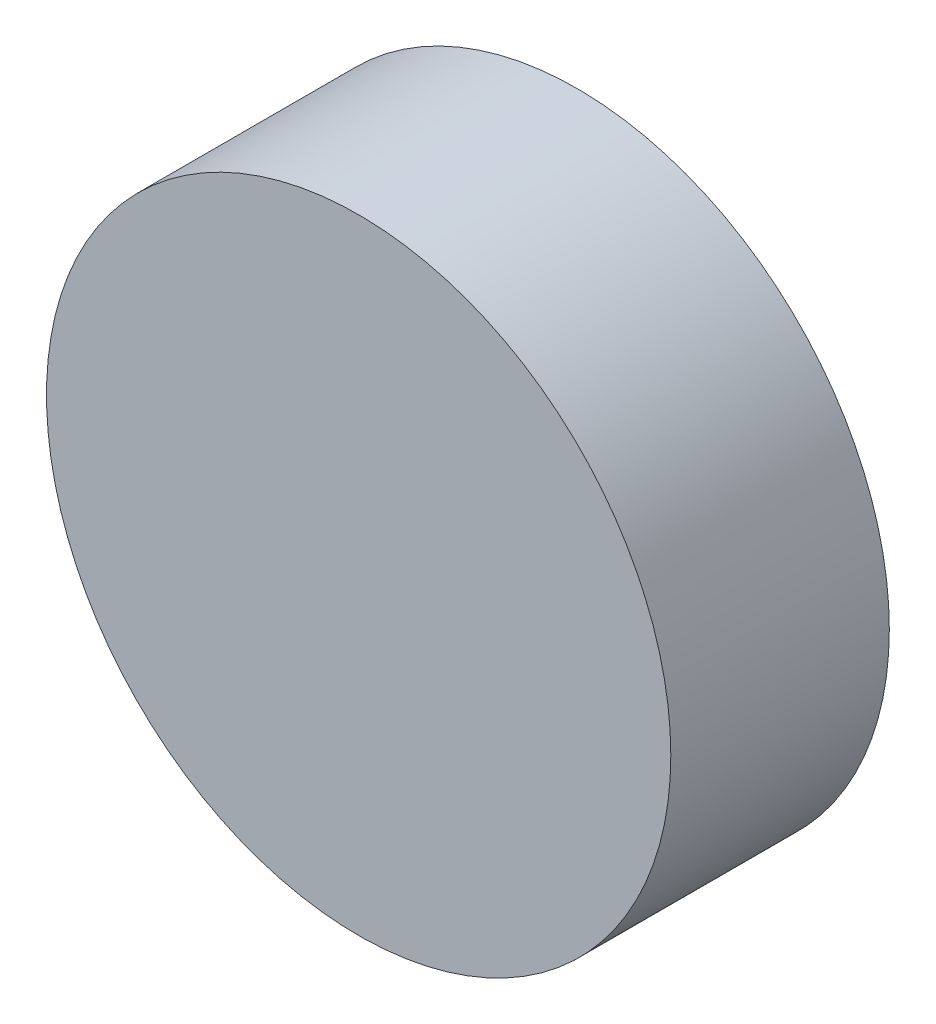
ISO-10303-21;
HEADER;
FILE_DESCRIPTION(('STEP AP214'),'2;1');
FILE_NAME('part.step','',(''),(''),'','','');
FILE_SCHEMA(('AUTOMOTIVE_DESIGN { 1 0 10303 214 1 1 1 1 }'));
ENDSEC;
DATA;
#1=APPLICATION_CONTEXT('core data for automotive mechanical design processes');
#2=APPLICATION_PROTOCOL_DEFINITION('international standard','automotive_design',2000,#1);
#3=PRODUCT_CONTEXT('',#1,'mechanical');
#4=PRODUCT('Part','Part','',(#3));
#5=PRODUCT_RELATED_PRODUCT_CATEGORY('part','',(#4));
#6=PRODUCT_DEFINITION_FORMATION('','',#4);
#7=PRODUCT_DEFINITION_CONTEXT('part definition',#1,'design');
#8=PRODUCT_DEFINITION('design','',#6,#7);
#9=PRODUCT_DEFINITION_SHAPE('','',#8);
#10=(LENGTH_UNIT() NAMED_UNIT(*) SI_UNIT(.MILLI.,.METRE.));
#11=(NAMED_UNIT(*) PLANE_ANGLE_UNIT() SI_UNIT($,.RADIAN.));
#12=(NAMED_UNIT(*) SI_UNIT($,.STERADIAN.) SOLID_ANGLE_UNIT());
#13=UNCERTAINTY_MEASURE_WITH_UNIT(LENGTH_MEASURE(1.E-05),#10,'distance_accuracy_value','');
#14=(GEOMETRIC_REPRESENTATION_CONTEXT(3) GLOBAL_UNCERTAINTY_ASSIGNED_CONTEXT((#13)) GLOBAL_UNIT_ASSIGNED_CONTEXT((#10,
#11,#12)) REPRESENTATION_CONTEXT('',''));
#15=CARTESIAN_POINT('',(0.,0.,0.));
#16=DIRECTION('',(0.,0.,1.));
#17=DIRECTION('',(1.,0.,0.));
#18=AXIS2_PLACEMENT_3D('',#15,#16,#17);
#19=CARTESIAN_POINT('',(0.,0.,17.78));
#20=DIRECTION('',(0.,0.,-1.));
#21=DIRECTION('',(-1.,0.,0.));
#22=AXIS2_PLACEMENT_3D('',#19,#20,#21);
#23=CYLINDRICAL_SURFACE('',#22,23.876);
#24=CARTESIAN_POINT('',(0.,0.,0.));
#25=DIRECTION('',(0.,0.,1.));
#26=DIRECTION('',(1.,0.,0.));
#27=AXIS2_PLACEMENT_3D('',#24,#25,#26);
#28=CIRCLE('',#27,23.876);
#29=CARTESIAN_POINT('',(23.876,0.,0.));
#30=VERTEX_POINT('',#29);
#31=EDGE_CURVE('E45',#30,#30,#28,.T.);
#32=ORIENTED_EDGE('',*,*,#31,.F.);
#33=EDGE_LOOP('',(#32));
#34=FACE_BOUND('',#33,.T.);
#35=CARTESIAN_POINT('',(0.,0.,15.24));
#36=DIRECTION('',(0.,0.,1.));
#37=DIRECTION('',(1.,0.,0.));
#38=AXIS2_PLACEMENT_3D('',#35,#36,#37);
#39=CIRCLE('',#38,23.876);
#40=CARTESIAN_POINT('',(23.876,0.,15.24));
#41=VERTEX_POINT('',#40);
#42=EDGE_CURVE('E49',#41,#41,#39,.T.);
#43=ORIENTED_EDGE('',*,*,#42,.T.);
#44=EDGE_LOOP('',(#43));
#45=FACE_BOUND('',#44,.T.);
#46=ADVANCED_FACE('F34',(#34,#45),#23,.F.);
#47=CARTESIAN_POINT('',(0.,0.,17.78));
#48=DIRECTION('',(0.,0.,1.));
#49=DIRECTION('',(1.,0.,0.));
#50=AXIS2_PLACEMENT_3D('',#47,#48,#49);
#51=PLANE('',#50);
#52=CARTESIAN_POINT('',(0.,0.,17.78));
#53=DIRECTION('',(0.,0.,1.));
#54=DIRECTION('',(1.,0.,0.));
#55=AXIS2_PLACEMENT_3D('',#52,#53,#54);
#56=CIRCLE('',#55,25.4);
#57=CARTESIAN_POINT('',(25.4,0.,17.78));
#58=VERTEX_POINT('',#57);
#59=EDGE_CURVE('E10',#58,#58,#56,.T.);
#60=ORIENTED_EDGE('',*,*,#59,.T.);
#61=EDGE_LOOP('',(#60));
#62=FACE_BOUND('',#61,.T.);
#63=ADVANCED_FACE('F64',(#62),#51,.T.);
#64=CARTESIAN_POINT('',(0.,0.,0.));
#65=DIRECTION('',(0.,0.,1.));
#66=DIRECTION('',(1.,0.,0.));
#67=AXIS2_PLACEMENT_3D('',#64,#65,#66);
#68=PLANE('',#67);
#69=CARTESIAN_POINT('',(0.,0.,0.));
#70=DIRECTION('',(0.,0.,1.));
#71=DIRECTION('',(1.,0.,0.));
#72=AXIS2_PLACEMENT_3D('',#69,#70,#71);
#73=CIRCLE('',#72,25.4);
#74=CARTESIAN_POINT('',(25.4,0.,0.));
#75=VERTEX_POINT('',#74);
#76=EDGE_CURVE('E38',#75,#75,#73,.T.);
#77=ORIENTED_EDGE('',*,*,#76,.F.);
#78=EDGE_LOOP('',(#77));
#79=FACE_BOUND('',#78,.T.);
#80=ORIENTED_EDGE('',*,*,#31,.T.);
#81=EDGE_LOOP('',(#80));
#82=FACE_BOUND('',#81,.T.);
#83=ADVANCED_FACE('F60',(#79,#82),#68,.F.);
#84=CARTESIAN_POINT('',(0.,0.,17.78));
#85=DIRECTION('',(0.,0.,-1.));
#86=DIRECTION('',(-1.,0.,0.));
#87=AXIS2_PLACEMENT_3D('',#84,#85,#86);
#88=CYLINDRICAL_SURFACE('',#87,25.4);
#89=ORIENTED_EDGE('',*,*,#59,.F.);
#90=EDGE_LOOP('',(#89));
#91=FACE_BOUND('',#90,.T.);
#92=ORIENTED_EDGE('',*,*,#76,.T.);
#93=EDGE_LOOP('',(#92));
#94=FACE_BOUND('',#93,.T.);
#95=ADVANCED_FACE('F36',(#91,#94),#88,.T.);
#96=CARTESIAN_POINT('',(0.,0.,15.24));
#97=DIRECTION('',(0.,0.,1.));
#98=DIRECTION('',(1.,0.,0.));
#99=AXIS2_PLACEMENT_3D('',#96,#97,#98);
#100=PLANE('',#99);
#101=ORIENTED_EDGE('',*,*,#42,.F.);
#102=EDGE_LOOP('',(#101));
#103=FACE_BOUND('',#102,.T.);
#104=ADVANCED_FACE('F54',(#103),#100,.F.);
#105=CLOSED_SHELL('',(#46,#63,#83,#95,#104));
#106=MANIFOLD_SOLID_BREP('B2',#105);
#107=ADVANCED_BREP_SHAPE_REPRESENTATION('',(#18,#106),#14);
#108=SHAPE_DEFINITION_REPRESENTATION(#9,#107);
ENDSEC;
END-ISO-10303-21;
